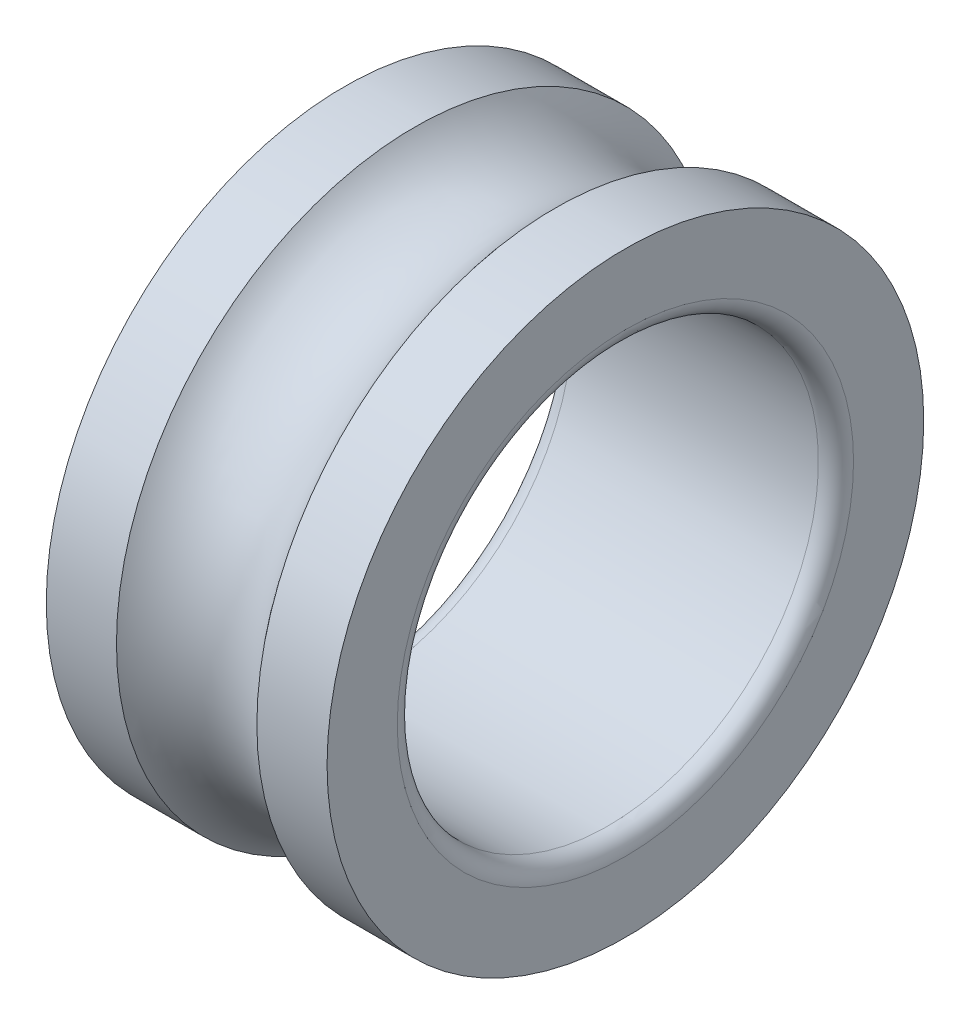
ISO-10303-21;
HEADER;
FILE_DESCRIPTION(('STEP AP214'),'2;1');
FILE_NAME('part.step','',(''),(''),'','','');
FILE_SCHEMA(('AUTOMOTIVE_DESIGN { 1 0 10303 214 1 1 1 1 }'));
ENDSEC;
DATA;
#1=APPLICATION_CONTEXT('core data for automotive mechanical design processes');
#2=APPLICATION_PROTOCOL_DEFINITION('international standard','automotive_design',2000,#1);
#3=PRODUCT_CONTEXT('',#1,'mechanical');
#4=PRODUCT('Part','Part','',(#3));
#5=PRODUCT_RELATED_PRODUCT_CATEGORY('part','',(#4));
#6=PRODUCT_DEFINITION_FORMATION('','',#4);
#7=PRODUCT_DEFINITION_CONTEXT('part definition',#1,'design');
#8=PRODUCT_DEFINITION('design','',#6,#7);
#9=PRODUCT_DEFINITION_SHAPE('','',#8);
#10=(LENGTH_UNIT() NAMED_UNIT(*) SI_UNIT(.MILLI.,.METRE.));
#11=(NAMED_UNIT(*) PLANE_ANGLE_UNIT() SI_UNIT($,.RADIAN.));
#12=(NAMED_UNIT(*) SI_UNIT($,.STERADIAN.) SOLID_ANGLE_UNIT());
#13=UNCERTAINTY_MEASURE_WITH_UNIT(LENGTH_MEASURE(1.E-05),#10,'distance_accuracy_value','');
#14=(GEOMETRIC_REPRESENTATION_CONTEXT(3) GLOBAL_UNCERTAINTY_ASSIGNED_CONTEXT((#13)) GLOBAL_UNIT_ASSIGNED_CONTEXT((#10,
#11,#12)) REPRESENTATION_CONTEXT('',''));
#15=CARTESIAN_POINT('',(0.,0.,0.));
#16=DIRECTION('',(0.,0.,1.));
#17=DIRECTION('',(1.,0.,0.));
#18=AXIS2_PLACEMENT_3D('',#15,#16,#17);
#19=CARTESIAN_POINT('',(4.,0.,0.));
#20=DIRECTION('',(-1.,0.,0.));
#21=DIRECTION('',(0.,0.,1.));
#22=AXIS2_PLACEMENT_3D('',#19,#20,#21);
#23=TOROIDAL_SURFACE('',#22,10.,2.5);
#24=CARTESIAN_POINT('',(6.,0.,0.));
#25=DIRECTION('',(-1.,0.,0.));
#26=DIRECTION('',(0.,0.,1.));
#27=AXIS2_PLACEMENT_3D('',#24,#25,#26);
#28=CIRCLE('',#27,8.5);
#29=CARTESIAN_POINT('',(6.,0.,8.5));
#30=VERTEX_POINT('',#29);
#31=EDGE_CURVE('E57',#30,#30,#28,.T.);
#32=ORIENTED_EDGE('',*,*,#31,.T.);
#33=EDGE_LOOP('',(#32));
#34=FACE_BOUND('',#33,.T.);
#35=CARTESIAN_POINT('',(2.,0.,0.));
#36=DIRECTION('',(-1.,0.,0.));
#37=DIRECTION('',(0.,0.,1.));
#38=AXIS2_PLACEMENT_3D('',#35,#36,#37);
#39=CIRCLE('',#38,8.5);
#40=CARTESIAN_POINT('',(2.,0.,8.5));
#41=VERTEX_POINT('',#40);
#42=EDGE_CURVE('E10',#41,#41,#39,.T.);
#43=ORIENTED_EDGE('',*,*,#42,.F.);
#44=EDGE_LOOP('',(#43));
#45=FACE_BOUND('',#44,.T.);
#46=ADVANCED_FACE('F29',(#34,#45),#23,.F.);
#47=CARTESIAN_POINT('',(0.,0.,0.));
#48=DIRECTION('',(-1.,0.,0.));
#49=DIRECTION('',(0.,0.,1.));
#50=AXIS2_PLACEMENT_3D('',#47,#48,#49);
#51=CYLINDRICAL_SURFACE('',#50,8.5);
#52=ORIENTED_EDGE('',*,*,#42,.T.);
#53=EDGE_LOOP('',(#52));
#54=FACE_BOUND('',#53,.T.);
#55=CARTESIAN_POINT('',(0.,0.,0.));
#56=DIRECTION('',(-1.,0.,0.));
#57=DIRECTION('',(0.,0.,1.));
#58=AXIS2_PLACEMENT_3D('',#55,#56,#57);
#59=CIRCLE('',#58,8.5);
#60=CARTESIAN_POINT('',(0.,0.,8.5));
#61=VERTEX_POINT('',#60);
#62=EDGE_CURVE('E35',#61,#61,#59,.T.);
#63=ORIENTED_EDGE('',*,*,#62,.F.);
#64=EDGE_LOOP('',(#63));
#65=FACE_BOUND('',#64,.T.);
#66=ADVANCED_FACE('F75',(#54,#65),#51,.T.);
#67=CARTESIAN_POINT('',(0.,8.5,0.));
#68=DIRECTION('',(1.,0.,0.));
#69=DIRECTION('',(0.,0.,-1.));
#70=AXIS2_PLACEMENT_3D('',#67,#68,#69);
#71=PLANE('',#70);
#72=CARTESIAN_POINT('',(0.,0.,0.));
#73=DIRECTION('',(-1.,0.,0.));
#74=DIRECTION('',(0.,0.,1.));
#75=AXIS2_PLACEMENT_3D('',#72,#73,#74);
#76=CIRCLE('',#75,6.5);
#77=CARTESIAN_POINT('',(0.,0.,6.5));
#78=VERTEX_POINT('',#77);
#79=EDGE_CURVE('E39',#78,#78,#76,.T.);
#80=ORIENTED_EDGE('',*,*,#79,.F.);
#81=EDGE_LOOP('',(#80));
#82=FACE_BOUND('',#81,.T.);
#83=ORIENTED_EDGE('',*,*,#62,.T.);
#84=EDGE_LOOP('',(#83));
#85=FACE_BOUND('',#84,.T.);
#86=ADVANCED_FACE('F79',(#82,#85),#71,.F.);
#87=CARTESIAN_POINT('',(0.5,0.,0.));
#88=DIRECTION('',(-1.,0.,0.));
#89=DIRECTION('',(0.,0.,1.));
#90=AXIS2_PLACEMENT_3D('',#87,#88,#89);
#91=TOROIDAL_SURFACE('',#90,6.5,0.5);
#92=ORIENTED_EDGE('',*,*,#79,.T.);
#93=EDGE_LOOP('',(#92));
#94=FACE_BOUND('',#93,.T.);
#95=CARTESIAN_POINT('',(0.500000000000003,0.,0.));
#96=DIRECTION('',(-1.,0.,0.));
#97=DIRECTION('',(0.,0.,1.));
#98=AXIS2_PLACEMENT_3D('',#95,#96,#97);
#99=CIRCLE('',#98,6.);
#100=CARTESIAN_POINT('',(0.500000000000003,0.,6.));
#101=VERTEX_POINT('',#100);
#102=EDGE_CURVE('E43',#101,#101,#99,.T.);
#103=ORIENTED_EDGE('',*,*,#102,.F.);
#104=EDGE_LOOP('',(#103));
#105=FACE_BOUND('',#104,.T.);
#106=ADVANCED_FACE('F83',(#94,#105),#91,.T.);
#107=CARTESIAN_POINT('',(0.,0.,0.));
#108=DIRECTION('',(-1.,0.,0.));
#109=DIRECTION('',(0.,0.,1.));
#110=AXIS2_PLACEMENT_3D('',#107,#108,#109);
#111=CYLINDRICAL_SURFACE('',#110,6.);
#112=ORIENTED_EDGE('',*,*,#102,.T.);
#113=EDGE_LOOP('',(#112));
#114=FACE_BOUND('',#113,.T.);
#115=CARTESIAN_POINT('',(7.5,0.,0.));
#116=DIRECTION('',(-1.,0.,0.));
#117=DIRECTION('',(0.,0.,1.));
#118=AXIS2_PLACEMENT_3D('',#115,#116,#117);
#119=CIRCLE('',#118,6.);
#120=CARTESIAN_POINT('',(7.5,0.,6.));
#121=VERTEX_POINT('',#120);
#122=EDGE_CURVE('E48',#121,#121,#119,.T.);
#123=ORIENTED_EDGE('',*,*,#122,.F.);
#124=EDGE_LOOP('',(#123));
#125=FACE_BOUND('',#124,.T.);
#126=ADVANCED_FACE('F90',(#114,#125),#111,.F.);
#127=CARTESIAN_POINT('',(7.5,0.,0.));
#128=DIRECTION('',(-1.,0.,0.));
#129=DIRECTION('',(0.,0.,1.));
#130=AXIS2_PLACEMENT_3D('',#127,#128,#129);
#131=TOROIDAL_SURFACE('',#130,6.5,0.5);
#132=ORIENTED_EDGE('',*,*,#122,.T.);
#133=EDGE_LOOP('',(#132));
#134=FACE_BOUND('',#133,.T.);
#135=CARTESIAN_POINT('',(8.,0.,0.));
#136=DIRECTION('',(-1.,0.,0.));
#137=DIRECTION('',(0.,0.,1.));
#138=AXIS2_PLACEMENT_3D('',#135,#136,#137);
#139=CIRCLE('',#138,6.5);
#140=CARTESIAN_POINT('',(8.,0.,6.5));
#141=VERTEX_POINT('',#140);
#142=EDGE_CURVE('E51',#141,#141,#139,.T.);
#143=ORIENTED_EDGE('',*,*,#142,.F.);
#144=EDGE_LOOP('',(#143));
#145=FACE_BOUND('',#144,.T.);
#146=ADVANCED_FACE('F71',(#134,#145),#131,.T.);
#147=CARTESIAN_POINT('',(8.,6.5,0.));
#148=DIRECTION('',(-1.,0.,0.));
#149=DIRECTION('',(0.,0.,1.));
#150=AXIS2_PLACEMENT_3D('',#147,#148,#149);
#151=PLANE('',#150);
#152=CARTESIAN_POINT('',(8.,0.,0.));
#153=DIRECTION('',(-1.,0.,0.));
#154=DIRECTION('',(0.,0.,1.));
#155=AXIS2_PLACEMENT_3D('',#152,#153,#154);
#156=CIRCLE('',#155,8.5);
#157=CARTESIAN_POINT('',(8.,0.,8.5));
#158=VERTEX_POINT('',#157);
#159=EDGE_CURVE('E54',#158,#158,#156,.T.);
#160=ORIENTED_EDGE('',*,*,#159,.F.);
#161=EDGE_LOOP('',(#160));
#162=FACE_BOUND('',#161,.T.);
#163=ORIENTED_EDGE('',*,*,#142,.T.);
#164=EDGE_LOOP('',(#163));
#165=FACE_BOUND('',#164,.T.);
#166=ADVANCED_FACE('F65',(#162,#165),#151,.F.);
#167=CARTESIAN_POINT('',(0.,0.,0.));
#168=DIRECTION('',(-1.,0.,0.));
#169=DIRECTION('',(0.,0.,1.));
#170=AXIS2_PLACEMENT_3D('',#167,#168,#169);
#171=CYLINDRICAL_SURFACE('',#170,8.5);
#172=ORIENTED_EDGE('',*,*,#159,.T.);
#173=EDGE_LOOP('',(#172));
#174=FACE_BOUND('',#173,.T.);
#175=ORIENTED_EDGE('',*,*,#31,.F.);
#176=EDGE_LOOP('',(#175));
#177=FACE_BOUND('',#176,.T.);
#178=ADVANCED_FACE('F63',(#174,#177),#171,.T.);
#179=CLOSED_SHELL('',(#46,#66,#86,#106,#126,#146,#166,#178));
#180=MANIFOLD_SOLID_BREP('B2',#179);
#181=ADVANCED_BREP_SHAPE_REPRESENTATION('',(#18,#180),#14);
#182=SHAPE_DEFINITION_REPRESENTATION(#9,#181);
ENDSEC;
END-ISO-10303-21;
